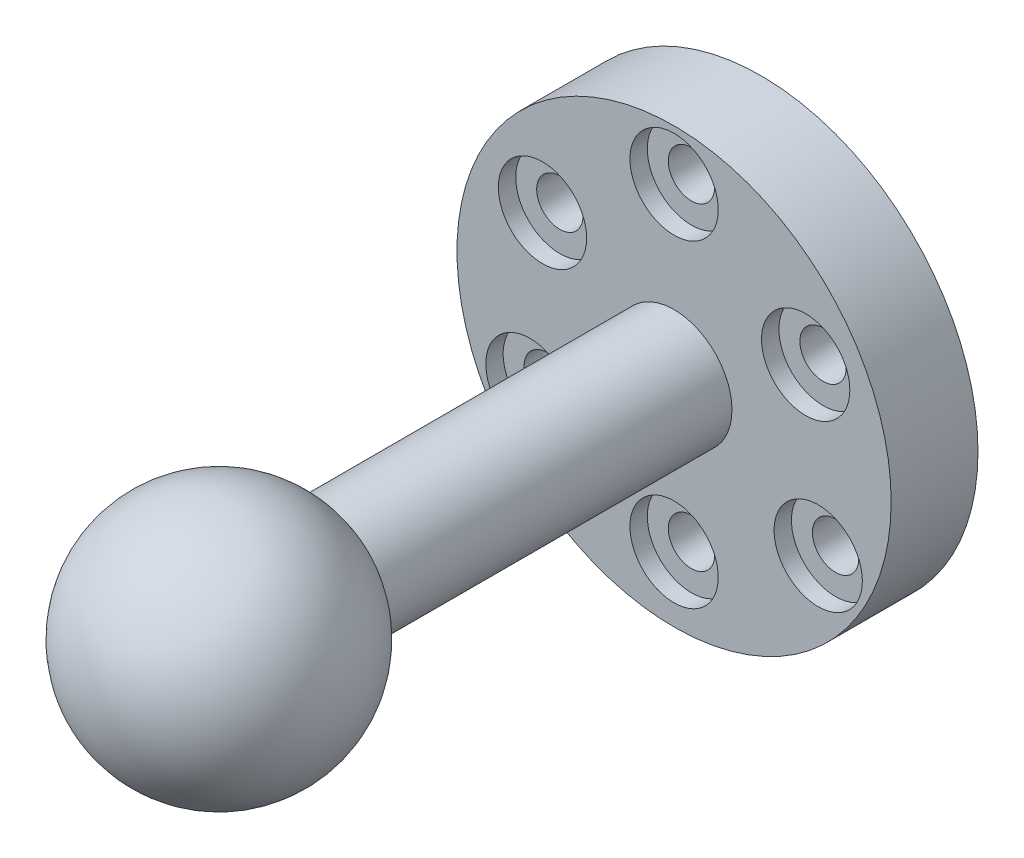
ISO-10303-21;
HEADER;
FILE_DESCRIPTION(('STEP AP214'),'2;1');
FILE_NAME('part.step','',(''),(''),'','','');
FILE_SCHEMA(('AUTOMOTIVE_DESIGN { 1 0 10303 214 1 1 1 1 }'));
ENDSEC;
DATA;
#1=APPLICATION_CONTEXT('core data for automotive mechanical design processes');
#2=APPLICATION_PROTOCOL_DEFINITION('international standard','automotive_design',2000,#1);
#3=PRODUCT_CONTEXT('',#1,'mechanical');
#4=PRODUCT('Part','Part','',(#3));
#5=PRODUCT_RELATED_PRODUCT_CATEGORY('part','',(#4));
#6=PRODUCT_DEFINITION_FORMATION('','',#4);
#7=PRODUCT_DEFINITION_CONTEXT('part definition',#1,'design');
#8=PRODUCT_DEFINITION('design','',#6,#7);
#9=PRODUCT_DEFINITION_SHAPE('','',#8);
#10=(LENGTH_UNIT() NAMED_UNIT(*) SI_UNIT(.MILLI.,.METRE.));
#11=(NAMED_UNIT(*) PLANE_ANGLE_UNIT() SI_UNIT($,.RADIAN.));
#12=(NAMED_UNIT(*) SI_UNIT($,.STERADIAN.) SOLID_ANGLE_UNIT());
#13=UNCERTAINTY_MEASURE_WITH_UNIT(LENGTH_MEASURE(1.E-05),#10,'distance_accuracy_value','');
#14=(GEOMETRIC_REPRESENTATION_CONTEXT(3) GLOBAL_UNCERTAINTY_ASSIGNED_CONTEXT((#13)) GLOBAL_UNIT_ASSIGNED_CONTEXT((#10,
#11,#12)) REPRESENTATION_CONTEXT('',''));
#15=CARTESIAN_POINT('',(0.,0.,0.));
#16=DIRECTION('',(0.,0.,1.));
#17=DIRECTION('',(1.,0.,0.));
#18=AXIS2_PLACEMENT_3D('',#15,#16,#17);
#19=CARTESIAN_POINT('',(0.,-10.5,0.));
#20=DIRECTION('',(0.,0.,1.));
#21=DIRECTION('',(1.,0.,0.));
#22=AXIS2_PLACEMENT_3D('',#19,#20,#21);
#23=CYLINDRICAL_SURFACE('',#22,1.6);
#24=CARTESIAN_POINT('',(0.,-10.5,0.));
#25=DIRECTION('',(0.,0.,1.));
#26=DIRECTION('',(1.,0.,0.));
#27=AXIS2_PLACEMENT_3D('',#24,#25,#26);
#28=CIRCLE('',#27,1.6);
#29=CARTESIAN_POINT('',(1.60000000000003,-10.5,0.));
#30=VERTEX_POINT('',#29);
#31=EDGE_CURVE('E54',#30,#30,#28,.T.);
#32=ORIENTED_EDGE('',*,*,#31,.F.);
#33=EDGE_LOOP('',(#32));
#34=FACE_BOUND('',#33,.T.);
#35=CARTESIAN_POINT('',(0.,-10.5,4.8));
#36=DIRECTION('',(0.,0.,1.));
#37=DIRECTION('',(1.,0.,0.));
#38=AXIS2_PLACEMENT_3D('',#35,#36,#37);
#39=CIRCLE('',#38,1.6);
#40=CARTESIAN_POINT('',(1.60000000000003,-10.5,4.8));
#41=VERTEX_POINT('',#40);
#42=EDGE_CURVE('E71',#41,#41,#39,.F.);
#43=ORIENTED_EDGE('',*,*,#42,.F.);
#44=EDGE_LOOP('',(#43));
#45=FACE_BOUND('',#44,.T.);
#46=ADVANCED_FACE('F39',(#34,#45),#23,.F.);
#47=CARTESIAN_POINT('',(-9.09326673973662,5.24999999999998,0.));
#48=DIRECTION('',(0.,0.,1.));
#49=DIRECTION('',(1.,0.,0.));
#50=AXIS2_PLACEMENT_3D('',#47,#48,#49);
#51=CYLINDRICAL_SURFACE('',#50,1.6);
#52=CARTESIAN_POINT('',(-9.09326673973662,5.24999999999998,0.));
#53=DIRECTION('',(0.,0.,1.));
#54=DIRECTION('',(1.,0.,0.));
#55=AXIS2_PLACEMENT_3D('',#52,#53,#54);
#56=CIRCLE('',#55,1.6);
#57=CARTESIAN_POINT('',(-7.49326673973662,5.24999999999998,0.));
#58=VERTEX_POINT('',#57);
#59=EDGE_CURVE('E93',#58,#58,#56,.T.);
#60=ORIENTED_EDGE('',*,*,#59,.F.);
#61=EDGE_LOOP('',(#60));
#62=FACE_BOUND('',#61,.T.);
#63=CARTESIAN_POINT('',(-9.09326673973662,5.24999999999998,4.8));
#64=DIRECTION('',(0.,0.,1.));
#65=DIRECTION('',(1.,0.,0.));
#66=AXIS2_PLACEMENT_3D('',#63,#64,#65);
#67=CIRCLE('',#66,1.6);
#68=CARTESIAN_POINT('',(-7.49326673973662,5.24999999999998,4.8));
#69=VERTEX_POINT('',#68);
#70=EDGE_CURVE('E72',#69,#69,#67,.F.);
#71=ORIENTED_EDGE('',*,*,#70,.F.);
#72=EDGE_LOOP('',(#71));
#73=FACE_BOUND('',#72,.T.);
#74=ADVANCED_FACE('F103',(#62,#73),#51,.F.);
#75=CARTESIAN_POINT('',(9.95929214352105,-5.75,0.));
#76=DIRECTION('',(0.,0.,1.));
#77=DIRECTION('',(1.,0.,0.));
#78=AXIS2_PLACEMENT_3D('',#75,#76,#77);
#79=CYLINDRICAL_SURFACE('',#78,1.6);
#80=CARTESIAN_POINT('',(9.95929214352105,-5.75,0.));
#81=DIRECTION('',(0.,0.,1.));
#82=DIRECTION('',(1.,0.,0.));
#83=AXIS2_PLACEMENT_3D('',#80,#81,#82);
#84=CIRCLE('',#83,1.6);
#85=CARTESIAN_POINT('',(11.5592921435211,-5.75,0.));
#86=VERTEX_POINT('',#85);
#87=EDGE_CURVE('E87',#86,#86,#84,.T.);
#88=ORIENTED_EDGE('',*,*,#87,.F.);
#89=EDGE_LOOP('',(#88));
#90=FACE_BOUND('',#89,.T.);
#91=CARTESIAN_POINT('',(9.95929214352105,-5.75,4.8));
#92=DIRECTION('',(0.,0.,1.));
#93=DIRECTION('',(1.,0.,0.));
#94=AXIS2_PLACEMENT_3D('',#91,#92,#93);
#95=CIRCLE('',#94,1.6);
#96=CARTESIAN_POINT('',(11.5592921435211,-5.75,4.8));
#97=VERTEX_POINT('',#96);
#98=EDGE_CURVE('E70',#97,#97,#95,.F.);
#99=ORIENTED_EDGE('',*,*,#98,.F.);
#100=EDGE_LOOP('',(#99));
#101=FACE_BOUND('',#100,.T.);
#102=ADVANCED_FACE('F97',(#90,#101),#79,.F.);
#103=CARTESIAN_POINT('',(-9.95929214352104,-5.75000000000001,0.));
#104=DIRECTION('',(0.,0.,1.));
#105=DIRECTION('',(1.,0.,0.));
#106=AXIS2_PLACEMENT_3D('',#103,#104,#105);
#107=CYLINDRICAL_SURFACE('',#106,1.6);
#108=CARTESIAN_POINT('',(-9.95929214352104,-5.75000000000001,0.));
#109=DIRECTION('',(0.,0.,1.));
#110=DIRECTION('',(1.,0.,0.));
#111=AXIS2_PLACEMENT_3D('',#108,#109,#110);
#112=CIRCLE('',#111,1.6);
#113=CARTESIAN_POINT('',(-8.35929214352104,-5.75000000000001,0.));
#114=VERTEX_POINT('',#113);
#115=EDGE_CURVE('E84',#114,#114,#112,.T.);
#116=ORIENTED_EDGE('',*,*,#115,.F.);
#117=EDGE_LOOP('',(#116));
#118=FACE_BOUND('',#117,.T.);
#119=CARTESIAN_POINT('',(-9.95929214352104,-5.75000000000001,4.8));
#120=DIRECTION('',(0.,0.,1.));
#121=DIRECTION('',(1.,0.,0.));
#122=AXIS2_PLACEMENT_3D('',#119,#120,#121);
#123=CIRCLE('',#122,1.6);
#124=CARTESIAN_POINT('',(-8.35929214352104,-5.75000000000001,4.8));
#125=VERTEX_POINT('',#124);
#126=EDGE_CURVE('E65',#125,#125,#123,.F.);
#127=ORIENTED_EDGE('',*,*,#126,.F.);
#128=EDGE_LOOP('',(#127));
#129=FACE_BOUND('',#128,.T.);
#130=ADVANCED_FACE('F105',(#118,#129),#107,.F.);
#131=CARTESIAN_POINT('',(9.09326673973659,5.25000000000003,0.));
#132=DIRECTION('',(0.,0.,1.));
#133=DIRECTION('',(1.,0.,0.));
#134=AXIS2_PLACEMENT_3D('',#131,#132,#133);
#135=CYLINDRICAL_SURFACE('',#134,1.6);
#136=CARTESIAN_POINT('',(9.09326673973659,5.25000000000003,0.));
#137=DIRECTION('',(0.,0.,1.));
#138=DIRECTION('',(1.,0.,0.));
#139=AXIS2_PLACEMENT_3D('',#136,#137,#138);
#140=CIRCLE('',#139,1.6);
#141=CARTESIAN_POINT('',(10.6932667397366,5.25000000000003,0.));
#142=VERTEX_POINT('',#141);
#143=EDGE_CURVE('E79',#142,#142,#140,.T.);
#144=ORIENTED_EDGE('',*,*,#143,.F.);
#145=EDGE_LOOP('',(#144));
#146=FACE_BOUND('',#145,.T.);
#147=CARTESIAN_POINT('',(9.09326673973659,5.25000000000003,4.8));
#148=DIRECTION('',(0.,0.,1.));
#149=DIRECTION('',(1.,0.,0.));
#150=AXIS2_PLACEMENT_3D('',#147,#148,#149);
#151=CIRCLE('',#150,1.6);
#152=CARTESIAN_POINT('',(10.6932667397366,5.25000000000003,4.8));
#153=VERTEX_POINT('',#152);
#154=EDGE_CURVE('E61',#153,#153,#151,.F.);
#155=ORIENTED_EDGE('',*,*,#154,.F.);
#156=EDGE_LOOP('',(#155));
#157=FACE_BOUND('',#156,.T.);
#158=ADVANCED_FACE('F154',(#146,#157),#135,.F.);
#159=CARTESIAN_POINT('',(0.,11.5,0.));
#160=DIRECTION('',(0.,0.,1.));
#161=DIRECTION('',(1.,0.,0.));
#162=AXIS2_PLACEMENT_3D('',#159,#160,#161);
#163=CYLINDRICAL_SURFACE('',#162,1.6);
#164=CARTESIAN_POINT('',(0.,11.5,0.));
#165=DIRECTION('',(0.,0.,1.));
#166=DIRECTION('',(1.,0.,0.));
#167=AXIS2_PLACEMENT_3D('',#164,#165,#166);
#168=CIRCLE('',#167,1.6);
#169=CARTESIAN_POINT('',(1.6,11.5,0.));
#170=VERTEX_POINT('',#169);
#171=EDGE_CURVE('E55',#170,#170,#168,.T.);
#172=ORIENTED_EDGE('',*,*,#171,.F.);
#173=EDGE_LOOP('',(#172));
#174=FACE_BOUND('',#173,.T.);
#175=CARTESIAN_POINT('',(0.,11.5,4.8));
#176=DIRECTION('',(0.,0.,1.));
#177=DIRECTION('',(1.,0.,0.));
#178=AXIS2_PLACEMENT_3D('',#175,#176,#177);
#179=CIRCLE('',#178,1.6);
#180=CARTESIAN_POINT('',(1.6,11.5,4.8));
#181=VERTEX_POINT('',#180);
#182=EDGE_CURVE('E59',#181,#181,#179,.F.);
#183=ORIENTED_EDGE('',*,*,#182,.F.);
#184=EDGE_LOOP('',(#183));
#185=FACE_BOUND('',#184,.T.);
#186=ADVANCED_FACE('F182',(#174,#185),#163,.F.);
#187=CARTESIAN_POINT('',(0.,0.,6.));
#188=DIRECTION('',(0.,0.,-1.));
#189=DIRECTION('',(-1.,0.,0.));
#190=AXIS2_PLACEMENT_3D('',#187,#188,#189);
#191=CYLINDRICAL_SURFACE('',#190,15.);
#192=CARTESIAN_POINT('',(0.,0.,6.));
#193=DIRECTION('',(0.,0.,1.));
#194=DIRECTION('',(1.,0.,0.));
#195=AXIS2_PLACEMENT_3D('',#192,#193,#194);
#196=CIRCLE('',#195,15.);
#197=CARTESIAN_POINT('',(15.,0.,6.));
#198=VERTEX_POINT('',#197);
#199=EDGE_CURVE('E10',#198,#198,#196,.T.);
#200=ORIENTED_EDGE('',*,*,#199,.F.);
#201=EDGE_LOOP('',(#200));
#202=FACE_BOUND('',#201,.T.);
#203=CARTESIAN_POINT('',(0.,0.,0.));
#204=DIRECTION('',(0.,0.,1.));
#205=DIRECTION('',(1.,0.,0.));
#206=AXIS2_PLACEMENT_3D('',#203,#204,#205);
#207=CIRCLE('',#206,15.);
#208=CARTESIAN_POINT('',(15.,0.,0.));
#209=VERTEX_POINT('',#208);
#210=EDGE_CURVE('E50',#209,#209,#207,.T.);
#211=ORIENTED_EDGE('',*,*,#210,.T.);
#212=EDGE_LOOP('',(#211));
#213=FACE_BOUND('',#212,.T.);
#214=ADVANCED_FACE('F41',(#202,#213),#191,.T.);
#215=CARTESIAN_POINT('',(0.,0.,6.));
#216=DIRECTION('',(0.,0.,1.));
#217=DIRECTION('',(1.,0.,0.));
#218=AXIS2_PLACEMENT_3D('',#215,#216,#217);
#219=PLANE('',#218);
#220=CARTESIAN_POINT('',(0.,0.,6.));
#221=DIRECTION('',(0.,0.,1.));
#222=DIRECTION('',(1.,0.,0.));
#223=AXIS2_PLACEMENT_3D('',#220,#221,#222);
#224=CIRCLE('',#223,4.);
#225=CARTESIAN_POINT('',(4.,0.,6.));
#226=VERTEX_POINT('',#225);
#227=EDGE_CURVE('E213',#226,#226,#224,.T.);
#228=ORIENTED_EDGE('',*,*,#227,.F.);
#229=EDGE_LOOP('',(#228));
#230=FACE_BOUND('',#229,.T.);
#231=CARTESIAN_POINT('',(-9.95929214352104,-5.75000000000001,6.));
#232=DIRECTION('',(0.,0.,1.));
#233=DIRECTION('',(1.,0.,0.));
#234=AXIS2_PLACEMENT_3D('',#231,#232,#233);
#235=CIRCLE('',#234,3.05);
#236=CARTESIAN_POINT('',(-6.90929214352104,-5.75000000000001,6.));
#237=VERTEX_POINT('',#236);
#238=EDGE_CURVE('E214',#237,#237,#235,.T.);
#239=ORIENTED_EDGE('',*,*,#238,.F.);
#240=EDGE_LOOP('',(#239));
#241=FACE_BOUND('',#240,.T.);
#242=CARTESIAN_POINT('',(0.,-10.5,6.));
#243=DIRECTION('',(0.,0.,1.));
#244=DIRECTION('',(1.,0.,0.));
#245=AXIS2_PLACEMENT_3D('',#242,#243,#244);
#246=CIRCLE('',#245,3.05);
#247=CARTESIAN_POINT('',(3.05000000000003,-10.5,6.));
#248=VERTEX_POINT('',#247);
#249=EDGE_CURVE('E244',#248,#248,#246,.T.);
#250=ORIENTED_EDGE('',*,*,#249,.F.);
#251=EDGE_LOOP('',(#250));
#252=FACE_BOUND('',#251,.T.);
#253=CARTESIAN_POINT('',(9.95929214352105,-5.75,6.));
#254=DIRECTION('',(0.,0.,1.));
#255=DIRECTION('',(1.,0.,0.));
#256=AXIS2_PLACEMENT_3D('',#253,#254,#255);
#257=CIRCLE('',#256,3.05);
#258=CARTESIAN_POINT('',(13.009292143521,-5.75,6.));
#259=VERTEX_POINT('',#258);
#260=EDGE_CURVE('E240',#259,#259,#257,.T.);
#261=ORIENTED_EDGE('',*,*,#260,.F.);
#262=EDGE_LOOP('',(#261));
#263=FACE_BOUND('',#262,.T.);
#264=CARTESIAN_POINT('',(9.09326673973659,5.25000000000003,6.));
#265=DIRECTION('',(0.,0.,1.));
#266=DIRECTION('',(1.,0.,0.));
#267=AXIS2_PLACEMENT_3D('',#264,#265,#266);
#268=CIRCLE('',#267,3.05);
#269=CARTESIAN_POINT('',(12.1432667397366,5.25000000000003,6.));
#270=VERTEX_POINT('',#269);
#271=EDGE_CURVE('E234',#270,#270,#268,.T.);
#272=ORIENTED_EDGE('',*,*,#271,.F.);
#273=EDGE_LOOP('',(#272));
#274=FACE_BOUND('',#273,.T.);
#275=CARTESIAN_POINT('',(0.,11.5,6.));
#276=DIRECTION('',(0.,0.,1.));
#277=DIRECTION('',(1.,0.,0.));
#278=AXIS2_PLACEMENT_3D('',#275,#276,#277);
#279=CIRCLE('',#278,3.05);
#280=CARTESIAN_POINT('',(3.05,11.5,6.));
#281=VERTEX_POINT('',#280);
#282=EDGE_CURVE('E227',#281,#281,#279,.T.);
#283=ORIENTED_EDGE('',*,*,#282,.F.);
#284=EDGE_LOOP('',(#283));
#285=FACE_BOUND('',#284,.T.);
#286=CARTESIAN_POINT('',(-9.09326673973662,5.24999999999998,6.));
#287=DIRECTION('',(0.,0.,1.));
#288=DIRECTION('',(1.,0.,0.));
#289=AXIS2_PLACEMENT_3D('',#286,#287,#288);
#290=CIRCLE('',#289,3.05);
#291=CARTESIAN_POINT('',(-6.04326673973662,5.24999999999998,6.));
#292=VERTEX_POINT('',#291);
#293=EDGE_CURVE('E226',#292,#292,#290,.T.);
#294=ORIENTED_EDGE('',*,*,#293,.F.);
#295=EDGE_LOOP('',(#294));
#296=FACE_BOUND('',#295,.T.);
#297=ORIENTED_EDGE('',*,*,#199,.T.);
#298=EDGE_LOOP('',(#297));
#299=FACE_BOUND('',#298,.T.);
#300=ADVANCED_FACE('F137',(#230,#241,#252,#263,#274,#285,#296,#299),#219,.T.);
#301=CARTESIAN_POINT('',(0.,0.,0.));
#302=DIRECTION('',(0.,0.,1.));
#303=DIRECTION('',(1.,0.,0.));
#304=AXIS2_PLACEMENT_3D('',#301,#302,#303);
#305=PLANE('',#304);
#306=ORIENTED_EDGE('',*,*,#171,.T.);
#307=EDGE_LOOP('',(#306));
#308=FACE_BOUND('',#307,.T.);
#309=ORIENTED_EDGE('',*,*,#143,.T.);
#310=EDGE_LOOP('',(#309));
#311=FACE_BOUND('',#310,.T.);
#312=ORIENTED_EDGE('',*,*,#115,.T.);
#313=EDGE_LOOP('',(#312));
#314=FACE_BOUND('',#313,.T.);
#315=ORIENTED_EDGE('',*,*,#87,.T.);
#316=EDGE_LOOP('',(#315));
#317=FACE_BOUND('',#316,.T.);
#318=ORIENTED_EDGE('',*,*,#59,.T.);
#319=EDGE_LOOP('',(#318));
#320=FACE_BOUND('',#319,.T.);
#321=ORIENTED_EDGE('',*,*,#31,.T.);
#322=EDGE_LOOP('',(#321));
#323=FACE_BOUND('',#322,.T.);
#324=ORIENTED_EDGE('',*,*,#210,.F.);
#325=EDGE_LOOP('',(#324));
#326=FACE_BOUND('',#325,.T.);
#327=ADVANCED_FACE('F96',(#308,#311,#314,#317,#320,#323,#326),#305,.F.);
#328=CARTESIAN_POINT('',(0.,11.5,4.8));
#329=DIRECTION('',(0.,0.,1.));
#330=DIRECTION('',(1.,0.,0.));
#331=AXIS2_PLACEMENT_3D('',#328,#329,#330);
#332=PLANE('',#331);
#333=CARTESIAN_POINT('',(0.,11.5,4.8));
#334=DIRECTION('',(0.,0.,1.));
#335=DIRECTION('',(1.,0.,0.));
#336=AXIS2_PLACEMENT_3D('',#333,#334,#335);
#337=CIRCLE('',#336,3.05);
#338=CARTESIAN_POINT('',(3.05,11.5,4.8));
#339=VERTEX_POINT('',#338);
#340=EDGE_CURVE('E224',#339,#339,#337,.T.);
#341=ORIENTED_EDGE('',*,*,#340,.T.);
#342=EDGE_LOOP('',(#341));
#343=FACE_BOUND('',#342,.T.);
#344=ORIENTED_EDGE('',*,*,#182,.T.);
#345=EDGE_LOOP('',(#344));
#346=FACE_BOUND('',#345,.T.);
#347=ADVANCED_FACE('F136',(#343,#346),#332,.T.);
#348=CARTESIAN_POINT('',(0.,11.5,4.8));
#349=DIRECTION('',(0.,0.,1.));
#350=DIRECTION('',(1.,0.,0.));
#351=AXIS2_PLACEMENT_3D('',#348,#349,#350);
#352=CYLINDRICAL_SURFACE('',#351,3.05);
#353=ORIENTED_EDGE('',*,*,#340,.F.);
#354=EDGE_LOOP('',(#353));
#355=FACE_BOUND('',#354,.T.);
#356=ORIENTED_EDGE('',*,*,#282,.T.);
#357=EDGE_LOOP('',(#356));
#358=FACE_BOUND('',#357,.T.);
#359=ADVANCED_FACE('F144',(#355,#358),#352,.F.);
#360=CARTESIAN_POINT('',(9.09326673973659,5.25000000000003,4.8));
#361=DIRECTION('',(0.,0.,1.));
#362=DIRECTION('',(1.,0.,0.));
#363=AXIS2_PLACEMENT_3D('',#360,#361,#362);
#364=PLANE('',#363);
#365=CARTESIAN_POINT('',(9.09326673973659,5.25000000000003,4.8));
#366=DIRECTION('',(0.,0.,1.));
#367=DIRECTION('',(1.,0.,0.));
#368=AXIS2_PLACEMENT_3D('',#365,#366,#367);
#369=CIRCLE('',#368,3.05);
#370=CARTESIAN_POINT('',(12.1432667397366,5.25000000000003,4.8));
#371=VERTEX_POINT('',#370);
#372=EDGE_CURVE('E230',#371,#371,#369,.T.);
#373=ORIENTED_EDGE('',*,*,#372,.T.);
#374=EDGE_LOOP('',(#373));
#375=FACE_BOUND('',#374,.T.);
#376=ORIENTED_EDGE('',*,*,#154,.T.);
#377=EDGE_LOOP('',(#376));
#378=FACE_BOUND('',#377,.T.);
#379=ADVANCED_FACE('F167',(#375,#378),#364,.T.);
#380=CARTESIAN_POINT('',(9.09326673973659,5.25000000000003,4.8));
#381=DIRECTION('',(0.,0.,1.));
#382=DIRECTION('',(1.,0.,0.));
#383=AXIS2_PLACEMENT_3D('',#380,#381,#382);
#384=CYLINDRICAL_SURFACE('',#383,3.05);
#385=ORIENTED_EDGE('',*,*,#372,.F.);
#386=EDGE_LOOP('',(#385));
#387=FACE_BOUND('',#386,.T.);
#388=ORIENTED_EDGE('',*,*,#271,.T.);
#389=EDGE_LOOP('',(#388));
#390=FACE_BOUND('',#389,.T.);
#391=ADVANCED_FACE('F159',(#387,#390),#384,.F.);
#392=CARTESIAN_POINT('',(-9.95929214352104,-5.75000000000001,4.8));
#393=DIRECTION('',(0.,0.,1.));
#394=DIRECTION('',(1.,0.,0.));
#395=AXIS2_PLACEMENT_3D('',#392,#393,#394);
#396=PLANE('',#395);
#397=CARTESIAN_POINT('',(-9.95929214352104,-5.75000000000001,4.8));
#398=DIRECTION('',(0.,0.,1.));
#399=DIRECTION('',(1.,0.,0.));
#400=AXIS2_PLACEMENT_3D('',#397,#398,#399);
#401=CIRCLE('',#400,3.05);
#402=CARTESIAN_POINT('',(-6.90929214352104,-5.75000000000001,4.8));
#403=VERTEX_POINT('',#402);
#404=EDGE_CURVE('E219',#403,#403,#401,.T.);
#405=ORIENTED_EDGE('',*,*,#404,.T.);
#406=EDGE_LOOP('',(#405));
#407=FACE_BOUND('',#406,.T.);
#408=ORIENTED_EDGE('',*,*,#126,.T.);
#409=EDGE_LOOP('',(#408));
#410=FACE_BOUND('',#409,.T.);
#411=ADVANCED_FACE('F120',(#407,#410),#396,.T.);
#412=CARTESIAN_POINT('',(-9.95929214352104,-5.75000000000001,4.8));
#413=DIRECTION('',(0.,0.,1.));
#414=DIRECTION('',(1.,0.,0.));
#415=AXIS2_PLACEMENT_3D('',#412,#413,#414);
#416=CYLINDRICAL_SURFACE('',#415,3.05);
#417=ORIENTED_EDGE('',*,*,#404,.F.);
#418=EDGE_LOOP('',(#417));
#419=FACE_BOUND('',#418,.T.);
#420=ORIENTED_EDGE('',*,*,#238,.T.);
#421=EDGE_LOOP('',(#420));
#422=FACE_BOUND('',#421,.T.);
#423=ADVANCED_FACE('F109',(#419,#422),#416,.F.);
#424=CARTESIAN_POINT('',(9.95929214352105,-5.75,4.8));
#425=DIRECTION('',(0.,0.,1.));
#426=DIRECTION('',(1.,0.,0.));
#427=AXIS2_PLACEMENT_3D('',#424,#425,#426);
#428=PLANE('',#427);
#429=CARTESIAN_POINT('',(9.95929214352105,-5.75,4.8));
#430=DIRECTION('',(0.,0.,1.));
#431=DIRECTION('',(1.,0.,0.));
#432=AXIS2_PLACEMENT_3D('',#429,#430,#431);
#433=CIRCLE('',#432,3.05);
#434=CARTESIAN_POINT('',(13.009292143521,-5.75,4.8));
#435=VERTEX_POINT('',#434);
#436=EDGE_CURVE('E233',#435,#435,#433,.T.);
#437=ORIENTED_EDGE('',*,*,#436,.T.);
#438=EDGE_LOOP('',(#437));
#439=FACE_BOUND('',#438,.T.);
#440=ORIENTED_EDGE('',*,*,#98,.T.);
#441=EDGE_LOOP('',(#440));
#442=FACE_BOUND('',#441,.T.);
#443=ADVANCED_FACE('F110',(#439,#442),#428,.T.);
#444=CARTESIAN_POINT('',(9.95929214352105,-5.75,4.8));
#445=DIRECTION('',(0.,0.,1.));
#446=DIRECTION('',(1.,0.,0.));
#447=AXIS2_PLACEMENT_3D('',#444,#445,#446);
#448=CYLINDRICAL_SURFACE('',#447,3.05);
#449=ORIENTED_EDGE('',*,*,#436,.F.);
#450=EDGE_LOOP('',(#449));
#451=FACE_BOUND('',#450,.T.);
#452=ORIENTED_EDGE('',*,*,#260,.T.);
#453=EDGE_LOOP('',(#452));
#454=FACE_BOUND('',#453,.T.);
#455=ADVANCED_FACE('F108',(#451,#454),#448,.F.);
#456=CARTESIAN_POINT('',(-9.09326673973662,5.24999999999998,4.8));
#457=DIRECTION('',(0.,0.,1.));
#458=DIRECTION('',(1.,0.,0.));
#459=AXIS2_PLACEMENT_3D('',#456,#457,#458);
#460=PLANE('',#459);
#461=CARTESIAN_POINT('',(-9.09326673973662,5.24999999999998,4.8));
#462=DIRECTION('',(0.,0.,1.));
#463=DIRECTION('',(1.,0.,0.));
#464=AXIS2_PLACEMENT_3D('',#461,#462,#463);
#465=CIRCLE('',#464,3.05);
#466=CARTESIAN_POINT('',(-6.04326673973662,5.24999999999998,4.8));
#467=VERTEX_POINT('',#466);
#468=EDGE_CURVE('E62',#467,#467,#465,.T.);
#469=ORIENTED_EDGE('',*,*,#468,.T.);
#470=EDGE_LOOP('',(#469));
#471=FACE_BOUND('',#470,.T.);
#472=ORIENTED_EDGE('',*,*,#70,.T.);
#473=EDGE_LOOP('',(#472));
#474=FACE_BOUND('',#473,.T.);
#475=ADVANCED_FACE('F117',(#471,#474),#460,.T.);
#476=CARTESIAN_POINT('',(-9.09326673973662,5.24999999999998,4.8));
#477=DIRECTION('',(0.,0.,1.));
#478=DIRECTION('',(1.,0.,0.));
#479=AXIS2_PLACEMENT_3D('',#476,#477,#478);
#480=CYLINDRICAL_SURFACE('',#479,3.05);
#481=ORIENTED_EDGE('',*,*,#468,.F.);
#482=EDGE_LOOP('',(#481));
#483=FACE_BOUND('',#482,.T.);
#484=ORIENTED_EDGE('',*,*,#293,.T.);
#485=EDGE_LOOP('',(#484));
#486=FACE_BOUND('',#485,.T.);
#487=ADVANCED_FACE('F175',(#483,#486),#480,.F.);
#488=CARTESIAN_POINT('',(0.,-10.5,4.8));
#489=DIRECTION('',(0.,0.,1.));
#490=DIRECTION('',(1.,0.,0.));
#491=AXIS2_PLACEMENT_3D('',#488,#489,#490);
#492=PLANE('',#491);
#493=CARTESIAN_POINT('',(0.,-10.5,4.8));
#494=DIRECTION('',(0.,0.,1.));
#495=DIRECTION('',(1.,0.,0.));
#496=AXIS2_PLACEMENT_3D('',#493,#494,#495);
#497=CIRCLE('',#496,3.05);
#498=CARTESIAN_POINT('',(3.05000000000003,-10.5,4.8));
#499=VERTEX_POINT('',#498);
#500=EDGE_CURVE('E238',#499,#499,#497,.T.);
#501=ORIENTED_EDGE('',*,*,#500,.T.);
#502=EDGE_LOOP('',(#501));
#503=FACE_BOUND('',#502,.T.);
#504=ORIENTED_EDGE('',*,*,#42,.T.);
#505=EDGE_LOOP('',(#504));
#506=FACE_BOUND('',#505,.T.);
#507=ADVANCED_FACE('F176',(#503,#506),#492,.T.);
#508=CARTESIAN_POINT('',(0.,-10.5,4.8));
#509=DIRECTION('',(0.,0.,1.));
#510=DIRECTION('',(1.,0.,0.));
#511=AXIS2_PLACEMENT_3D('',#508,#509,#510);
#512=CYLINDRICAL_SURFACE('',#511,3.05);
#513=ORIENTED_EDGE('',*,*,#500,.F.);
#514=EDGE_LOOP('',(#513));
#515=FACE_BOUND('',#514,.T.);
#516=ORIENTED_EDGE('',*,*,#249,.T.);
#517=EDGE_LOOP('',(#516));
#518=FACE_BOUND('',#517,.T.);
#519=ADVANCED_FACE('F168',(#515,#518),#512,.F.);
#520=CARTESIAN_POINT('',(0.,0.,31.));
#521=DIRECTION('',(0.,0.,-1.));
#522=DIRECTION('',(-1.,0.,0.));
#523=AXIS2_PLACEMENT_3D('',#520,#521,#522);
#524=CYLINDRICAL_SURFACE('',#523,4.);
#525=CARTESIAN_POINT('',(0.,0.,30.0067144351436));
#526=DIRECTION('',(0.,0.,1.));
#527=DIRECTION('',(1.,0.,0.));
#528=AXIS2_PLACEMENT_3D('',#525,#526,#527);
#529=CIRCLE('',#528,4.);
#530=CARTESIAN_POINT('',(4.,0.,30.0067144351436));
#531=VERTEX_POINT('',#530);
#532=EDGE_CURVE('E43',#531,#531,#529,.F.);
#533=ORIENTED_EDGE('',*,*,#532,.T.);
#534=EDGE_LOOP('',(#533));
#535=FACE_BOUND('',#534,.T.);
#536=ORIENTED_EDGE('',*,*,#227,.T.);
#537=EDGE_LOOP('',(#536));
#538=FACE_BOUND('',#537,.T.);
#539=ADVANCED_FACE('F205',(#535,#538),#524,.T.);
#540=CARTESIAN_POINT('',(0.,0.,37.45));
#541=DIRECTION('',(0.,0.,-1.));
#542=DIRECTION('',(-1.,0.,0.));
#543=AXIS2_PLACEMENT_3D('',#540,#541,#542);
#544=SPHERICAL_SURFACE('',#543,8.45);
#545=ORIENTED_EDGE('',*,*,#532,.F.);
#546=EDGE_LOOP('',(#545));
#547=FACE_BOUND('',#546,.T.);
#548=ADVANCED_FACE('F202',(#547),#544,.T.);
#549=CLOSED_SHELL('',(#46,#74,#102,#130,#158,#186,#214,#300,#327,#347,#359,#379,#391,#411,#423,
#443,#455,#475,#487,#507,#519,#539,#548));
#550=MANIFOLD_SOLID_BREP('B2',#549);
#551=ADVANCED_BREP_SHAPE_REPRESENTATION('',(#18,#550),#14);
#552=SHAPE_DEFINITION_REPRESENTATION(#9,#551);
ENDSEC;
END-ISO-10303-21;
